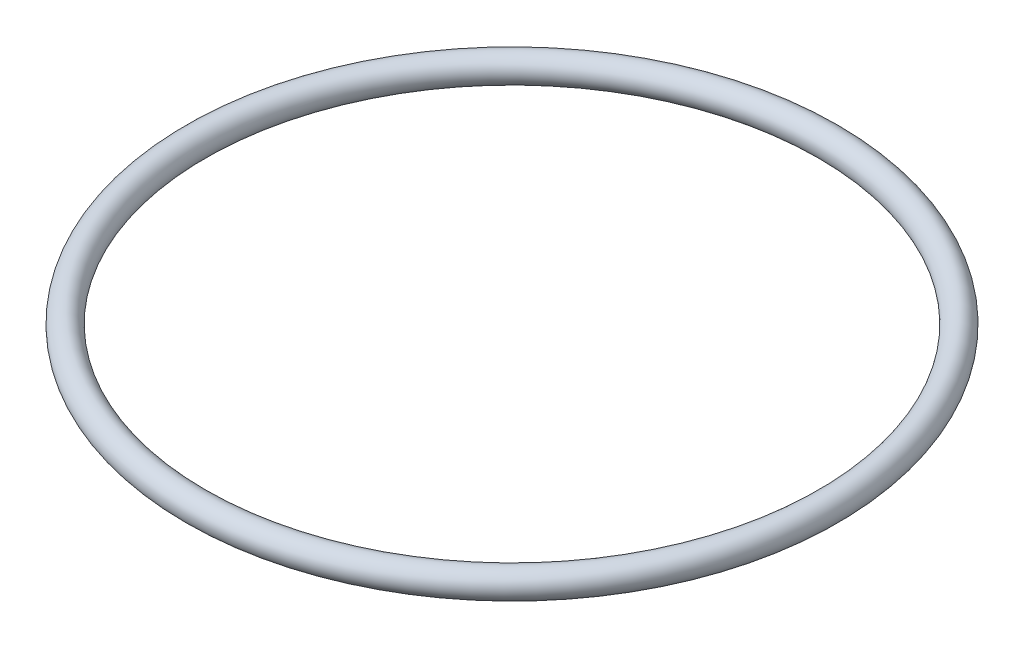
ISO-10303-21;
HEADER;
FILE_DESCRIPTION(('STEP AP214'),'2;1');
FILE_NAME('part.step','',(''),(''),'','','');
FILE_SCHEMA(('AUTOMOTIVE_DESIGN { 1 0 10303 214 1 1 1 1 }'));
ENDSEC;
DATA;
#1=APPLICATION_CONTEXT('core data for automotive mechanical design processes');
#2=APPLICATION_PROTOCOL_DEFINITION('international standard','automotive_design',2000,#1);
#3=PRODUCT_CONTEXT('',#1,'mechanical');
#4=PRODUCT('Part','Part','',(#3));
#5=PRODUCT_RELATED_PRODUCT_CATEGORY('part','',(#4));
#6=PRODUCT_DEFINITION_FORMATION('','',#4);
#7=PRODUCT_DEFINITION_CONTEXT('part definition',#1,'design');
#8=PRODUCT_DEFINITION('design','',#6,#7);
#9=PRODUCT_DEFINITION_SHAPE('','',#8);
#10=(LENGTH_UNIT() NAMED_UNIT(*) SI_UNIT(.MILLI.,.METRE.));
#11=(NAMED_UNIT(*) PLANE_ANGLE_UNIT() SI_UNIT($,.RADIAN.));
#12=(NAMED_UNIT(*) SI_UNIT($,.STERADIAN.) SOLID_ANGLE_UNIT());
#13=UNCERTAINTY_MEASURE_WITH_UNIT(LENGTH_MEASURE(1.E-05),#10,'distance_accuracy_value','');
#14=(GEOMETRIC_REPRESENTATION_CONTEXT(3) GLOBAL_UNCERTAINTY_ASSIGNED_CONTEXT((#13)) GLOBAL_UNIT_ASSIGNED_CONTEXT((#10,
#11,#12)) REPRESENTATION_CONTEXT('',''));
#15=CARTESIAN_POINT('',(0.,0.,0.));
#16=DIRECTION('',(0.,0.,1.));
#17=DIRECTION('',(1.,0.,0.));
#18=AXIS2_PLACEMENT_3D('',#15,#16,#17);
#19=CARTESIAN_POINT('',(0.,0.,0.));
#20=DIRECTION('',(0.,-1.,0.));
#21=DIRECTION('',(0.,0.,-1.));
#22=AXIS2_PLACEMENT_3D('',#19,#20,#21);
#23=TOROIDAL_SURFACE('',#22,37.10305,1.5875);
#24=CARTESIAN_POINT('',(0.,0.,-38.69055));
#25=VERTEX_POINT('',#24);
#26=VERTEX_LOOP('',#25);
#27=FACE_BOUND('',#26,.T.);
#28=ADVANCED_FACE('F29',(#27),#23,.T.);
#29=CLOSED_SHELL('',(#28));
#30=MANIFOLD_SOLID_BREP('B2',#29);
#31=ADVANCED_BREP_SHAPE_REPRESENTATION('',(#18,#30),#14);
#32=SHAPE_DEFINITION_REPRESENTATION(#9,#31);
ENDSEC;
END-ISO-10303-21;
